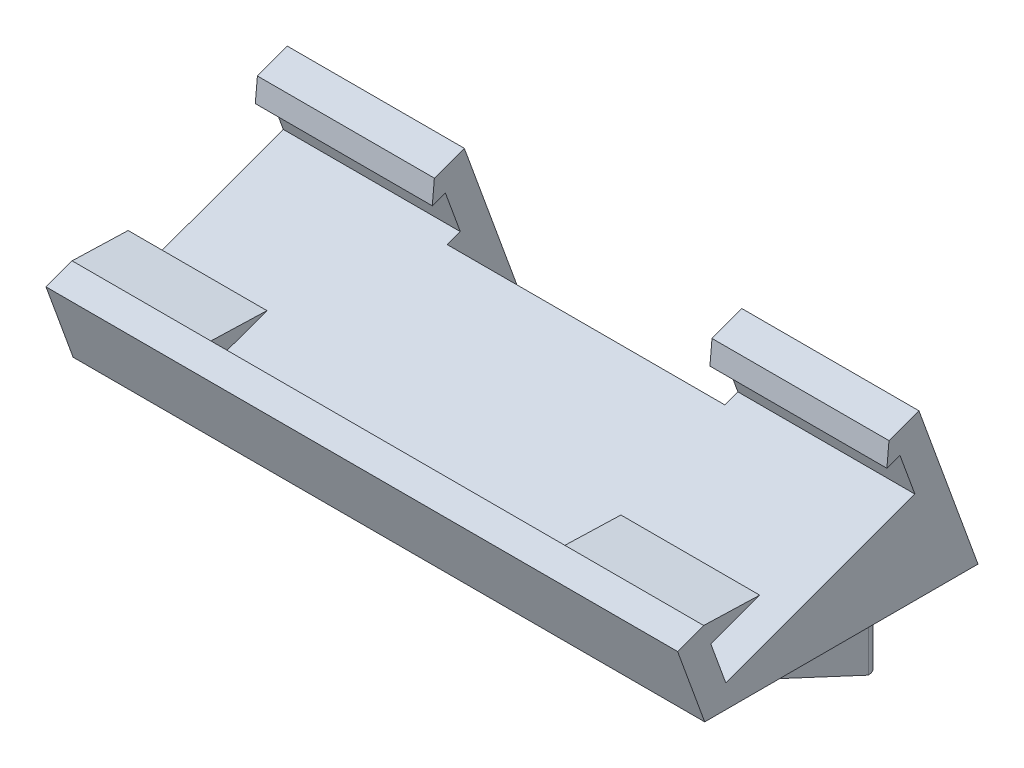
ISO-10303-21;
HEADER;
FILE_DESCRIPTION(('STEP AP214'),'2;1');
FILE_NAME('part.step','',(''),(''),'','','');
FILE_SCHEMA(('AUTOMOTIVE_DESIGN { 1 0 10303 214 1 1 1 1 }'));
ENDSEC;
DATA;
#1=APPLICATION_CONTEXT('core data for automotive mechanical design processes');
#2=APPLICATION_PROTOCOL_DEFINITION('international standard','automotive_design',2000,#1);
#3=PRODUCT_CONTEXT('',#1,'mechanical');
#4=PRODUCT('Part','Part','',(#3));
#5=PRODUCT_RELATED_PRODUCT_CATEGORY('part','',(#4));
#6=PRODUCT_DEFINITION_FORMATION('','',#4);
#7=PRODUCT_DEFINITION_CONTEXT('part definition',#1,'design');
#8=PRODUCT_DEFINITION('design','',#6,#7);
#9=PRODUCT_DEFINITION_SHAPE('','',#8);
#10=(LENGTH_UNIT() NAMED_UNIT(*) SI_UNIT(.MILLI.,.METRE.));
#11=(NAMED_UNIT(*) PLANE_ANGLE_UNIT() SI_UNIT($,.RADIAN.));
#12=(NAMED_UNIT(*) SI_UNIT($,.STERADIAN.) SOLID_ANGLE_UNIT());
#13=UNCERTAINTY_MEASURE_WITH_UNIT(LENGTH_MEASURE(1.E-05),#10,'distance_accuracy_value','');
#14=(GEOMETRIC_REPRESENTATION_CONTEXT(3) GLOBAL_UNCERTAINTY_ASSIGNED_CONTEXT((#13)) GLOBAL_UNIT_ASSIGNED_CONTEXT((#10,
#11,#12)) REPRESENTATION_CONTEXT('',''));
#15=CARTESIAN_POINT('',(0.,0.,0.));
#16=DIRECTION('',(0.,0.,1.));
#17=DIRECTION('',(1.,0.,0.));
#18=AXIS2_PLACEMENT_3D('',#15,#16,#17);
#19=CARTESIAN_POINT('',(45.5,0.,16.656373016007));
#20=DIRECTION('',(0.,1.,0.));
#21=DIRECTION('',(0.,0.,1.));
#22=AXIS2_PLACEMENT_3D('',#19,#20,#21);
#23=PLANE('',#22);
#24=CARTESIAN_POINT('',(-39.775,0.,4.8940842252026));
#25=DIRECTION('',(0.,-1.,0.));
#26=DIRECTION('',(0.,0.,1.));
#27=AXIS2_PLACEMENT_3D('',#24,#25,#26);
#28=CIRCLE('',#27,1.675);
#29=CARTESIAN_POINT('',(-38.1,0.,4.8940842252026));
#30=VERTEX_POINT('',#29);
#31=CARTESIAN_POINT('',(-41.45,0.,4.8940842252026));
#32=VERTEX_POINT('',#31);
#33=EDGE_CURVE('E317',#30,#32,#28,.T.);
#34=ORIENTED_EDGE('',*,*,#33,.F.);
#35=DIRECTION('',(0.,0.,1.));
#36=VECTOR('',#35,1.);
#37=CARTESIAN_POINT('',(-38.1,0.,4.8940842252026));
#38=LINE('',#37,#36);
#39=CARTESIAN_POINT('',(-38.1,0.,-10.9559157747974));
#40=VERTEX_POINT('',#39);
#41=EDGE_CURVE('E305',#40,#30,#38,.T.);
#42=ORIENTED_EDGE('',*,*,#41,.F.);
#43=CARTESIAN_POINT('',(-39.775,0.,-10.9559157747974));
#44=DIRECTION('',(0.,-1.,0.));
#45=DIRECTION('',(0.,0.,1.));
#46=AXIS2_PLACEMENT_3D('',#43,#44,#45);
#47=CIRCLE('',#46,1.675);
#48=CARTESIAN_POINT('',(-41.45,0.,-10.9559157747974));
#49=VERTEX_POINT('',#48);
#50=EDGE_CURVE('E309',#49,#40,#47,.T.);
#51=ORIENTED_EDGE('',*,*,#50,.F.);
#52=DIRECTION('',(0.,0.,-1.));
#53=VECTOR('',#52,1.);
#54=CARTESIAN_POINT('',(-41.45,0.,4.8940842252026));
#55=LINE('',#54,#53);
#56=EDGE_CURVE('E313',#32,#49,#55,.T.);
#57=ORIENTED_EDGE('',*,*,#56,.F.);
#58=EDGE_LOOP('',(#34,#42,#51,#57));
#59=FACE_BOUND('',#58,.T.);
#60=DIRECTION('',(-1.,0.,0.));
#61=VECTOR('',#60,1.);
#62=CARTESIAN_POINT('',(45.5,0.,-22.7182045656017));
#63=LINE('',#62,#61);
#64=CARTESIAN_POINT('',(-20.,0.,-22.7182045656017));
#65=VERTEX_POINT('',#64);
#66=CARTESIAN_POINT('',(-45.5,0.,-22.7182045656017));
#67=VERTEX_POINT('',#66);
#68=EDGE_CURVE('E444',#65,#67,#63,.T.);
#69=ORIENTED_EDGE('',*,*,#68,.F.);
#70=DIRECTION('',(0.,0.,-1.));
#71=VECTOR('',#70,1.);
#72=CARTESIAN_POINT('',(-20.,0.,-22.718642937185));
#73=LINE('',#72,#71);
#74=CARTESIAN_POINT('',(-20.,0.,-16.3331379307463));
#75=VERTEX_POINT('',#74);
#76=EDGE_CURVE('E396',#75,#65,#73,.T.);
#77=ORIENTED_EDGE('',*,*,#76,.F.);
#78=DIRECTION('',(-1.,0.,0.));
#79=VECTOR('',#78,1.);
#80=CARTESIAN_POINT('',(-20.,0.,-16.3331379307463));
#81=LINE('',#80,#79);
#82=CARTESIAN_POINT('',(20.,0.,-16.3331379307463));
#83=VERTEX_POINT('',#82);
#84=EDGE_CURVE('E357',#83,#75,#81,.T.);
#85=ORIENTED_EDGE('',*,*,#84,.F.);
#86=DIRECTION('',(0.,0.,1.));
#87=VECTOR('',#86,1.);
#88=CARTESIAN_POINT('',(20.,0.,-22.718642937185));
#89=LINE('',#88,#87);
#90=CARTESIAN_POINT('',(20.,0.,-22.7182045656017));
#91=VERTEX_POINT('',#90);
#92=EDGE_CURVE('E399',#91,#83,#89,.T.);
#93=ORIENTED_EDGE('',*,*,#92,.F.);
#94=CARTESIAN_POINT('',(45.5,0.,-22.7182045656017));
#95=VERTEX_POINT('',#94);
#96=EDGE_CURVE('E489',#95,#91,#63,.T.);
#97=ORIENTED_EDGE('',*,*,#96,.F.);
#98=DIRECTION('',(0.,0.,-1.));
#99=VECTOR('',#98,1.);
#100=CARTESIAN_POINT('',(45.5,0.,16.656373016007));
#101=LINE('',#100,#99);
#102=CARTESIAN_POINT('',(45.5,0.,16.656373016007));
#103=VERTEX_POINT('',#102);
#104=EDGE_CURVE('E441',#103,#95,#101,.T.);
#105=ORIENTED_EDGE('',*,*,#104,.F.);
#106=DIRECTION('',(-1.,0.,0.));
#107=VECTOR('',#106,1.);
#108=CARTESIAN_POINT('',(45.5,0.,16.656373016007));
#109=LINE('',#108,#107);
#110=CARTESIAN_POINT('',(-45.5,0.,16.656373016007));
#111=VERTEX_POINT('',#110);
#112=EDGE_CURVE('E493',#103,#111,#109,.T.);
#113=ORIENTED_EDGE('',*,*,#112,.T.);
#114=DIRECTION('',(0.,0.,-1.));
#115=VECTOR('',#114,1.);
#116=CARTESIAN_POINT('',(-45.5,0.,16.656373016007));
#117=LINE('',#116,#115);
#118=EDGE_CURVE('E411',#111,#67,#117,.T.);
#119=ORIENTED_EDGE('',*,*,#118,.T.);
#120=EDGE_LOOP('',(#69,#77,#85,#93,#97,#105,#113,#119));
#121=FACE_BOUND('',#120,.T.);
#122=CARTESIAN_POINT('',(39.775,0.,4.89408422520261));
#123=DIRECTION('',(0.,-1.,0.));
#124=DIRECTION('',(0.,0.,-1.));
#125=AXIS2_PLACEMENT_3D('',#122,#123,#124);
#126=CIRCLE('',#125,1.675);
#127=CARTESIAN_POINT('',(41.45,0.,4.89408422520261));
#128=VERTEX_POINT('',#127);
#129=CARTESIAN_POINT('',(38.1,0.,4.89408422520261));
#130=VERTEX_POINT('',#129);
#131=EDGE_CURVE('E321',#128,#130,#126,.T.);
#132=ORIENTED_EDGE('',*,*,#131,.F.);
#133=DIRECTION('',(0.,0.,1.));
#134=VECTOR('',#133,1.);
#135=CARTESIAN_POINT('',(41.45,0.,4.89408422520261));
#136=LINE('',#135,#134);
#137=CARTESIAN_POINT('',(41.45,0.,-10.9559157747974));
#138=VERTEX_POINT('',#137);
#139=EDGE_CURVE('E274',#138,#128,#136,.T.);
#140=ORIENTED_EDGE('',*,*,#139,.F.);
#141=CARTESIAN_POINT('',(39.775,0.,-10.9559157747974));
#142=DIRECTION('',(0.,-1.,0.));
#143=DIRECTION('',(0.,0.,-1.));
#144=AXIS2_PLACEMENT_3D('',#141,#142,#143);
#145=CIRCLE('',#144,1.675);
#146=CARTESIAN_POINT('',(38.1,0.,-10.9559157747974));
#147=VERTEX_POINT('',#146);
#148=EDGE_CURVE('E69',#147,#138,#145,.T.);
#149=ORIENTED_EDGE('',*,*,#148,.F.);
#150=DIRECTION('',(0.,0.,-1.));
#151=VECTOR('',#150,1.);
#152=CARTESIAN_POINT('',(38.1,0.,4.89408422520261));
#153=LINE('',#152,#151);
#154=EDGE_CURVE('E1015',#130,#147,#153,.T.);
#155=ORIENTED_EDGE('',*,*,#154,.F.);
#156=EDGE_LOOP('',(#132,#140,#149,#155));
#157=FACE_BOUND('',#156,.T.);
#158=ADVANCED_FACE('F46',(#59,#121,#157),#23,.F.);
#159=CARTESIAN_POINT('',(45.5,23.3938866763585,-14.2035261516107));
#160=DIRECTION('',(0.,-0.342020143325663,0.93969262078591));
#161=DIRECTION('',(0.,-0.93969262078591,-0.342020143325663));
#162=AXIS2_PLACEMENT_3D('',#159,#160,#161);
#163=PLANE('',#162);
#164=DIRECTION('',(-1.,0.,0.));
#165=VECTOR('',#164,1.);
#166=CARTESIAN_POINT('',(45.5,23.3938866763585,-14.2035261516107));
#167=LINE('',#166,#165);
#168=CARTESIAN_POINT('',(-20.,23.3938866763585,-14.2035261516107));
#169=VERTEX_POINT('',#168);
#170=CARTESIAN_POINT('',(-45.5,23.3938866763585,-14.2035261516107));
#171=VERTEX_POINT('',#170);
#172=EDGE_CURVE('E539',#169,#171,#167,.T.);
#173=ORIENTED_EDGE('',*,*,#172,.F.);
#174=DIRECTION('',(0.,0.93969262078591,0.342020143325664));
#175=VECTOR('',#174,1.);
#176=CARTESIAN_POINT('',(-20.,-0.00120441602640201,-22.718642937185));
#177=LINE('',#176,#175);
#178=EDGE_CURVE('E361',#65,#169,#177,.T.);
#179=ORIENTED_EDGE('',*,*,#178,.F.);
#180=ORIENTED_EDGE('',*,*,#68,.T.);
#181=DIRECTION('',(0.,0.93969262078591,0.342020143325663));
#182=VECTOR('',#181,1.);
#183=CARTESIAN_POINT('',(-45.5,23.3938866763585,-14.2035261516107));
#184=LINE('',#183,#182);
#185=EDGE_CURVE('E350',#67,#171,#184,.T.);
#186=ORIENTED_EDGE('',*,*,#185,.T.);
#187=EDGE_LOOP('',(#173,#179,#180,#186));
#188=FACE_BOUND('',#187,.T.);
#189=ADVANCED_FACE('F557',(#188),#163,.F.);
#190=CARTESIAN_POINT('',(45.5,21.8244123417544,-9.89143085687219));
#191=DIRECTION('',(0.,-0.93969262078591,-0.342020143325663));
#192=DIRECTION('',(0.,0.342020143325663,-0.93969262078591));
#193=AXIS2_PLACEMENT_3D('',#190,#191,#192);
#194=PLANE('',#193);
#195=DIRECTION('',(-1.,0.,0.));
#196=VECTOR('',#195,1.);
#197=CARTESIAN_POINT('',(45.5,21.8244123417544,-9.89143085687219));
#198=LINE('',#197,#196);
#199=CARTESIAN_POINT('',(-20.,21.8244123417544,-9.89143085687219));
#200=VERTEX_POINT('',#199);
#201=CARTESIAN_POINT('',(-45.5,21.8244123417544,-9.89143085687219));
#202=VERTEX_POINT('',#201);
#203=EDGE_CURVE('E535',#200,#202,#198,.T.);
#204=ORIENTED_EDGE('',*,*,#203,.F.);
#205=DIRECTION('',(0.,-0.342020143325664,0.93969262078591));
#206=VECTOR('',#205,1.);
#207=CARTESIAN_POINT('',(-20.,23.3938866763585,-14.2035261516107));
#208=LINE('',#207,#206);
#209=EDGE_CURVE('E377',#169,#200,#208,.T.);
#210=ORIENTED_EDGE('',*,*,#209,.F.);
#211=ORIENTED_EDGE('',*,*,#172,.T.);
#212=DIRECTION('',(0.,-0.342020143325663,0.93969262078591));
#213=VECTOR('',#212,1.);
#214=CARTESIAN_POINT('',(-45.5,21.8244123417544,-9.89143085687219));
#215=LINE('',#214,#213);
#216=EDGE_CURVE('E448',#171,#202,#215,.T.);
#217=ORIENTED_EDGE('',*,*,#216,.T.);
#218=EDGE_LOOP('',(#204,#210,#211,#217));
#219=FACE_BOUND('',#218,.T.);
#220=ADVANCED_FACE('F551',(#219),#194,.F.);
#221=CARTESIAN_POINT('',(45.5,21.8244123417544,-9.89143085687219));
#222=DIRECTION('',(0.,-0.0904888493177173,-0.995897468693015));
#223=DIRECTION('',(0.,0.995897468693016,-0.0904888493177173));
#224=AXIS2_PLACEMENT_3D('',#221,#222,#223);
#225=PLANE('',#224);
#226=DIRECTION('',(-1.,0.,0.));
#227=VECTOR('',#226,1.);
#228=CARTESIAN_POINT('',(45.5,18.5226879540468,-9.5914308568722));
#229=LINE('',#228,#227);
#230=CARTESIAN_POINT('',(-20.,18.5226879540468,-9.5914308568722));
#231=VERTEX_POINT('',#230);
#232=CARTESIAN_POINT('',(-45.5,18.5226879540468,-9.5914308568722));
#233=VERTEX_POINT('',#232);
#234=EDGE_CURVE('E530',#231,#233,#229,.T.);
#235=ORIENTED_EDGE('',*,*,#234,.F.);
#236=DIRECTION('',(0.,-0.995897468693016,0.0904888493177173));
#237=VECTOR('',#236,1.);
#238=CARTESIAN_POINT('',(-20.,1.33346656662751,-8.0295904938714));
#239=LINE('',#238,#237);
#240=EDGE_CURVE('E402',#200,#231,#239,.T.);
#241=ORIENTED_EDGE('',*,*,#240,.F.);
#242=ORIENTED_EDGE('',*,*,#203,.T.);
#243=DIRECTION('',(0.,-0.995897468693015,0.0904888493177173));
#244=VECTOR('',#243,1.);
#245=CARTESIAN_POINT('',(-45.5,21.8244123417544,-9.89143085687219));
#246=LINE('',#245,#244);
#247=EDGE_CURVE('E452',#202,#233,#246,.T.);
#248=ORIENTED_EDGE('',*,*,#247,.T.);
#249=EDGE_LOOP('',(#235,#241,#242,#248));
#250=FACE_BOUND('',#249,.T.);
#251=ADVANCED_FACE('F566',(#250),#225,.F.);
#252=CARTESIAN_POINT('',(45.5,19.2067282406981,-11.470816098444));
#253=DIRECTION('',(0.,0.93969262078591,0.342020143325664));
#254=DIRECTION('',(0.,-0.342020143325664,0.93969262078591));
#255=AXIS2_PLACEMENT_3D('',#252,#253,#254);
#256=PLANE('',#255);
#257=DIRECTION('',(-1.,0.,0.));
#258=VECTOR('',#257,1.);
#259=CARTESIAN_POINT('',(45.5,19.2067282406981,-11.470816098444));
#260=LINE('',#259,#258);
#261=CARTESIAN_POINT('',(-20.,19.2067282406981,-11.470816098444));
#262=VERTEX_POINT('',#261);
#263=CARTESIAN_POINT('',(-45.5,19.2067282406981,-11.470816098444));
#264=VERTEX_POINT('',#263);
#265=EDGE_CURVE('E525',#262,#264,#260,.T.);
#266=ORIENTED_EDGE('',*,*,#265,.F.);
#267=DIRECTION('',(0.,0.342020143325664,-0.93969262078591));
#268=VECTOR('',#267,1.);
#269=CARTESIAN_POINT('',(-20.,20.5748088140008,-15.2295865815877));
#270=LINE('',#269,#268);
#271=EDGE_CURVE('E383',#231,#262,#270,.T.);
#272=ORIENTED_EDGE('',*,*,#271,.F.);
#273=ORIENTED_EDGE('',*,*,#234,.T.);
#274=DIRECTION('',(0.,0.342020143325664,-0.93969262078591));
#275=VECTOR('',#274,1.);
#276=CARTESIAN_POINT('',(-45.5,19.2067282406981,-11.470816098444));
#277=LINE('',#276,#275);
#278=EDGE_CURVE('E456',#233,#264,#277,.T.);
#279=ORIENTED_EDGE('',*,*,#278,.T.);
#280=EDGE_LOOP('',(#266,#272,#273,#279));
#281=FACE_BOUND('',#280,.T.);
#282=ADVANCED_FACE('F637',(#281),#256,.F.);
#283=CARTESIAN_POINT('',(45.5,13.2866647297469,-13.6255430013957));
#284=DIRECTION('',(0.,0.342020143325664,-0.93969262078591));
#285=DIRECTION('',(0.,0.93969262078591,0.342020143325664));
#286=AXIS2_PLACEMENT_3D('',#283,#284,#285);
#287=PLANE('',#286);
#288=DIRECTION('',(-1.,0.,0.));
#289=VECTOR('',#288,1.);
#290=CARTESIAN_POINT('',(45.5,13.2866647297469,-13.6255430013957));
#291=LINE('',#290,#289);
#292=CARTESIAN_POINT('',(-20.,13.2866647297469,-13.6255430013957));
#293=VERTEX_POINT('',#292);
#294=CARTESIAN_POINT('',(-45.5,13.2866647297469,-13.6255430013957));
#295=VERTEX_POINT('',#294);
#296=EDGE_CURVE('E520',#293,#295,#291,.T.);
#297=ORIENTED_EDGE('',*,*,#296,.F.);
#298=DIRECTION('',(0.,-0.93969262078591,-0.342020143325664));
#299=VECTOR('',#298,1.);
#300=CARTESIAN_POINT('',(-20.,-1.36928498932906,-18.9598724540414));
#301=LINE('',#300,#299);
#302=EDGE_CURVE('E380',#262,#293,#301,.T.);
#303=ORIENTED_EDGE('',*,*,#302,.F.);
#304=ORIENTED_EDGE('',*,*,#265,.T.);
#305=DIRECTION('',(0.,-0.93969262078591,-0.342020143325664));
#306=VECTOR('',#305,1.);
#307=CARTESIAN_POINT('',(-45.5,13.2866647297469,-13.6255430013957));
#308=LINE('',#307,#306);
#309=EDGE_CURVE('E460',#264,#295,#308,.T.);
#310=ORIENTED_EDGE('',*,*,#309,.T.);
#311=EDGE_LOOP('',(#297,#303,#304,#310));
#312=FACE_BOUND('',#311,.T.);
#313=ADVANCED_FACE('F633',(#312),#287,.F.);
#314=CARTESIAN_POINT('',(45.5,9.28814408425389,15.7802699043474));
#315=DIRECTION('',(0.,0.93969262078591,0.342020143325663));
#316=DIRECTION('',(0.,-0.342020143325663,0.93969262078591));
#317=AXIS2_PLACEMENT_3D('',#314,#315,#316);
#318=PLANE('',#317);
#319=DIRECTION('',(-1.,0.,0.));
#320=VECTOR('',#319,1.);
#321=CARTESIAN_POINT('',(45.5,9.28814408425389,15.7802699043474));
#322=LINE('',#321,#320);
#323=CARTESIAN_POINT('',(45.5,9.28814408425389,15.7802699043474));
#324=VERTEX_POINT('',#323);
#325=CARTESIAN_POINT('',(25.5,9.28814408425389,15.7802699043474));
#326=VERTEX_POINT('',#325);
#327=EDGE_CURVE('E512',#324,#326,#322,.T.);
#328=ORIENTED_EDGE('',*,*,#327,.T.);
#329=DIRECTION('',(0.,-0.342020143325663,0.93969262078591));
#330=VECTOR('',#329,1.);
#331=CARTESIAN_POINT('',(25.5,11.8532951591964,8.73257524845306));
#332=LINE('',#331,#330);
#333=CARTESIAN_POINT('',(25.5,11.8532951591964,8.73257524845308));
#334=VERTEX_POINT('',#333);
#335=EDGE_CURVE('E334',#334,#326,#332,.T.);
#336=ORIENTED_EDGE('',*,*,#335,.F.);
#337=DIRECTION('',(-1.,0.,0.));
#338=VECTOR('',#337,1.);
#339=CARTESIAN_POINT('',(45.5,11.8532951591964,8.73257524845305));
#340=LINE('',#339,#338);
#341=CARTESIAN_POINT('',(45.5,11.8532951591964,8.73257524845305));
#342=VERTEX_POINT('',#341);
#343=EDGE_CURVE('E507',#342,#334,#340,.T.);
#344=ORIENTED_EDGE('',*,*,#343,.F.);
#345=DIRECTION('',(0.,0.342020143325663,-0.93969262078591));
#346=VECTOR('',#345,1.);
#347=CARTESIAN_POINT('',(45.5,9.28814408425389,15.7802699043474));
#348=LINE('',#347,#346);
#349=EDGE_CURVE('E429',#324,#342,#348,.T.);
#350=ORIENTED_EDGE('',*,*,#349,.F.);
#351=EDGE_LOOP('',(#328,#336,#344,#350));
#352=FACE_BOUND('',#351,.T.);
#353=ADVANCED_FACE('F610',(#352),#318,.F.);
#354=CARTESIAN_POINT('',(45.5,12.1072219466116,16.8063303343244));
#355=DIRECTION('',(0.,-0.999505787353044,0.0314353471075262));
#356=DIRECTION('',(0.,-0.0314353471075262,-0.999505787353045));
#357=AXIS2_PLACEMENT_3D('',#354,#355,#356);
#358=PLANE('',#357);
#359=ORIENTED_EDGE('',*,*,#343,.T.);
#360=DIRECTION('',(0.,-0.0314353471075262,-0.999505787353045));
#361=VECTOR('',#360,1.);
#362=CARTESIAN_POINT('',(25.5,11.5976575949158,0.604424982154378));
#363=LINE('',#362,#361);
#364=CARTESIAN_POINT('',(25.5,12.1072219466116,16.8063303343244));
#365=VERTEX_POINT('',#364);
#366=EDGE_CURVE('E329',#365,#334,#363,.T.);
#367=ORIENTED_EDGE('',*,*,#366,.F.);
#368=DIRECTION('',(-1.,0.,0.));
#369=VECTOR('',#368,1.);
#370=CARTESIAN_POINT('',(45.5,12.1072219466116,16.8063303343244));
#371=LINE('',#370,#369);
#372=CARTESIAN_POINT('',(45.5,12.1072219466116,16.8063303343244));
#373=VERTEX_POINT('',#372);
#374=EDGE_CURVE('E502',#373,#365,#371,.T.);
#375=ORIENTED_EDGE('',*,*,#374,.F.);
#376=DIRECTION('',(0.,0.0314353471075262,0.999505787353044));
#377=VECTOR('',#376,1.);
#378=CARTESIAN_POINT('',(45.5,12.1072219466116,16.8063303343244));
#379=LINE('',#378,#377);
#380=EDGE_CURVE('E432',#342,#373,#379,.T.);
#381=ORIENTED_EDGE('',*,*,#380,.F.);
#382=EDGE_LOOP('',(#359,#367,#375,#381));
#383=FACE_BOUND('',#382,.T.);
#384=ADVANCED_FACE('F604',(#383),#358,.F.);
#385=ORIENTED_EDGE('',*,*,#96,.T.);
#386=DIRECTION('',(0.,0.93969262078591,0.342020143325664));
#387=VECTOR('',#386,1.);
#388=CARTESIAN_POINT('',(20.,-0.00120441602639854,-22.718642937185));
#389=LINE('',#388,#387);
#390=CARTESIAN_POINT('',(20.,23.3938866763585,-14.2035261516107));
#391=VERTEX_POINT('',#390);
#392=EDGE_CURVE('E369',#91,#391,#389,.T.);
#393=ORIENTED_EDGE('',*,*,#392,.T.);
#394=CARTESIAN_POINT('',(45.5,23.3938866763585,-14.2035261516107));
#395=VERTEX_POINT('',#394);
#396=EDGE_CURVE('E55',#395,#391,#167,.T.);
#397=ORIENTED_EDGE('',*,*,#396,.F.);
#398=DIRECTION('',(0.,0.93969262078591,0.342020143325664));
#399=VECTOR('',#398,1.);
#400=CARTESIAN_POINT('',(45.5,14.6547453030495,-17.3843134845393));
#401=LINE('',#400,#399);
#402=EDGE_CURVE('E407',#95,#395,#401,.T.);
#403=ORIENTED_EDGE('',*,*,#402,.F.);
#404=EDGE_LOOP('',(#385,#393,#397,#403));
#405=FACE_BOUND('',#404,.T.);
#406=ADVANCED_FACE('F48',(#405),#163,.F.);
#407=ORIENTED_EDGE('',*,*,#396,.T.);
#408=DIRECTION('',(0.,0.342020143325664,-0.93969262078591));
#409=VECTOR('',#408,1.);
#410=CARTESIAN_POINT('',(20.,23.3938866763585,-14.2035261516107));
#411=LINE('',#410,#409);
#412=CARTESIAN_POINT('',(20.,21.8244123417544,-9.8914308568722));
#413=VERTEX_POINT('',#412);
#414=EDGE_CURVE('E365',#413,#391,#411,.T.);
#415=ORIENTED_EDGE('',*,*,#414,.F.);
#416=CARTESIAN_POINT('',(45.5,21.8244123417544,-9.89143085687219));
#417=VERTEX_POINT('',#416);
#418=EDGE_CURVE('E536',#417,#413,#198,.T.);
#419=ORIENTED_EDGE('',*,*,#418,.F.);
#420=DIRECTION('',(0.,-0.342020143325663,0.93969262078591));
#421=VECTOR('',#420,1.);
#422=CARTESIAN_POINT('',(45.5,21.8244123417544,-9.89143085687219));
#423=LINE('',#422,#421);
#424=EDGE_CURVE('E410',#395,#417,#423,.T.);
#425=ORIENTED_EDGE('',*,*,#424,.F.);
#426=EDGE_LOOP('',(#407,#415,#419,#425));
#427=FACE_BOUND('',#426,.T.);
#428=ADVANCED_FACE('F651',(#427),#194,.F.);
#429=ORIENTED_EDGE('',*,*,#418,.T.);
#430=DIRECTION('',(0.,0.995897468693016,-0.0904888493177173));
#431=VECTOR('',#430,1.);
#432=CARTESIAN_POINT('',(20.,1.33346656662752,-8.0295904938714));
#433=LINE('',#432,#431);
#434=CARTESIAN_POINT('',(20.,18.5226879540468,-9.5914308568722));
#435=VERTEX_POINT('',#434);
#436=EDGE_CURVE('E341',#435,#413,#433,.T.);
#437=ORIENTED_EDGE('',*,*,#436,.F.);
#438=CARTESIAN_POINT('',(45.5,18.5226879540468,-9.5914308568722));
#439=VERTEX_POINT('',#438);
#440=EDGE_CURVE('E531',#439,#435,#229,.T.);
#441=ORIENTED_EDGE('',*,*,#440,.F.);
#442=DIRECTION('',(0.,-0.995897468693015,0.0904888493177173));
#443=VECTOR('',#442,1.);
#444=CARTESIAN_POINT('',(45.5,21.8244123417544,-9.89143085687219));
#445=LINE('',#444,#443);
#446=EDGE_CURVE('E414',#417,#439,#445,.T.);
#447=ORIENTED_EDGE('',*,*,#446,.F.);
#448=EDGE_LOOP('',(#429,#437,#441,#447));
#449=FACE_BOUND('',#448,.T.);
#450=ADVANCED_FACE('F658',(#449),#225,.F.);
#451=ORIENTED_EDGE('',*,*,#440,.T.);
#452=DIRECTION('',(0.,-0.342020143325664,0.93969262078591));
#453=VECTOR('',#452,1.);
#454=CARTESIAN_POINT('',(20.,20.5748088140008,-15.2295865815877));
#455=LINE('',#454,#453);
#456=CARTESIAN_POINT('',(20.,19.2067282406981,-11.470816098444));
#457=VERTEX_POINT('',#456);
#458=EDGE_CURVE('E386',#457,#435,#455,.T.);
#459=ORIENTED_EDGE('',*,*,#458,.F.);
#460=CARTESIAN_POINT('',(45.5,19.2067282406981,-11.470816098444));
#461=VERTEX_POINT('',#460);
#462=EDGE_CURVE('E526',#461,#457,#260,.T.);
#463=ORIENTED_EDGE('',*,*,#462,.F.);
#464=DIRECTION('',(0.,0.342020143325664,-0.93969262078591));
#465=VECTOR('',#464,1.);
#466=CARTESIAN_POINT('',(45.5,19.2067282406981,-11.470816098444));
#467=LINE('',#466,#465);
#468=EDGE_CURVE('E417',#439,#461,#467,.T.);
#469=ORIENTED_EDGE('',*,*,#468,.F.);
#470=EDGE_LOOP('',(#451,#459,#463,#469));
#471=FACE_BOUND('',#470,.T.);
#472=ADVANCED_FACE('F661',(#471),#256,.F.);
#473=ORIENTED_EDGE('',*,*,#462,.T.);
#474=DIRECTION('',(0.,0.93969262078591,0.342020143325664));
#475=VECTOR('',#474,1.);
#476=CARTESIAN_POINT('',(20.,-1.36928498932906,-18.9598724540414));
#477=LINE('',#476,#475);
#478=CARTESIAN_POINT('',(20.,13.2866647297469,-13.6255430013957));
#479=VERTEX_POINT('',#478);
#480=EDGE_CURVE('E288',#479,#457,#477,.T.);
#481=ORIENTED_EDGE('',*,*,#480,.F.);
#482=CARTESIAN_POINT('',(45.5,13.2866647297469,-13.6255430013957));
#483=VERTEX_POINT('',#482);
#484=EDGE_CURVE('E521',#483,#479,#291,.T.);
#485=ORIENTED_EDGE('',*,*,#484,.F.);
#486=DIRECTION('',(0.,-0.93969262078591,-0.342020143325664));
#487=VECTOR('',#486,1.);
#488=CARTESIAN_POINT('',(45.5,13.2866647297469,-13.6255430013957));
#489=LINE('',#488,#487);
#490=EDGE_CURVE('E420',#461,#483,#489,.T.);
#491=ORIENTED_EDGE('',*,*,#490,.F.);
#492=EDGE_LOOP('',(#473,#481,#485,#491));
#493=FACE_BOUND('',#492,.T.);
#494=ADVANCED_FACE('F665',(#493),#287,.F.);
#495=CARTESIAN_POINT('',(45.5,3.36808057330265,13.6255430013957));
#496=DIRECTION('',(0.,-0.93969262078591,-0.342020143325663));
#497=DIRECTION('',(0.,0.342020143325663,-0.93969262078591));
#498=AXIS2_PLACEMENT_3D('',#495,#496,#497);
#499=PLANE('',#498);
#500=DIRECTION('',(1.,0.,0.));
#501=VECTOR('',#500,1.);
#502=CARTESIAN_POINT('',(-20.,12.6026244430956,-11.7461577598239));
#503=LINE('',#502,#501);
#504=CARTESIAN_POINT('',(-20.,12.6026244430956,-11.7461577598239));
#505=VERTEX_POINT('',#504);
#506=CARTESIAN_POINT('',(20.,12.6026244430956,-11.7461577598239));
#507=VERTEX_POINT('',#506);
#508=EDGE_CURVE('E353',#505,#507,#503,.T.);
#509=ORIENTED_EDGE('',*,*,#508,.F.);
#510=DIRECTION('',(0.,-0.342020143325663,0.93969262078591));
#511=VECTOR('',#510,1.);
#512=CARTESIAN_POINT('',(-20.,14.6547453030496,-17.3843134845394));
#513=LINE('',#512,#511);
#514=EDGE_CURVE('E389',#293,#505,#513,.T.);
#515=ORIENTED_EDGE('',*,*,#514,.F.);
#516=ORIENTED_EDGE('',*,*,#296,.T.);
#517=DIRECTION('',(0.,-0.342020143325663,0.93969262078591));
#518=VECTOR('',#517,1.);
#519=CARTESIAN_POINT('',(-45.5,3.36808057330265,13.6255430013957));
#520=LINE('',#519,#518);
#521=CARTESIAN_POINT('',(-45.5,3.36808057330265,13.6255430013957));
#522=VERTEX_POINT('',#521);
#523=EDGE_CURVE('E464',#295,#522,#520,.T.);
#524=ORIENTED_EDGE('',*,*,#523,.T.);
#525=DIRECTION('',(-1.,0.,0.));
#526=VECTOR('',#525,1.);
#527=CARTESIAN_POINT('',(45.5,3.36808057330265,13.6255430013957));
#528=LINE('',#527,#526);
#529=CARTESIAN_POINT('',(45.5,3.36808057330265,13.6255430013957));
#530=VERTEX_POINT('',#529);
#531=EDGE_CURVE('E516',#530,#522,#528,.T.);
#532=ORIENTED_EDGE('',*,*,#531,.F.);
#533=DIRECTION('',(0.,-0.342020143325663,0.93969262078591));
#534=VECTOR('',#533,1.);
#535=CARTESIAN_POINT('',(45.5,3.36808057330265,13.6255430013957));
#536=LINE('',#535,#534);
#537=EDGE_CURVE('E423',#483,#530,#536,.T.);
#538=ORIENTED_EDGE('',*,*,#537,.F.);
#539=ORIENTED_EDGE('',*,*,#484,.T.);
#540=DIRECTION('',(0.,0.342020143325663,-0.93969262078591));
#541=VECTOR('',#540,1.);
#542=CARTESIAN_POINT('',(20.,14.6547453030496,-17.3843134845394));
#543=LINE('',#542,#541);
#544=EDGE_CURVE('E393',#507,#479,#543,.T.);
#545=ORIENTED_EDGE('',*,*,#544,.F.);
#546=EDGE_LOOP('',(#509,#515,#516,#524,#532,#538,#539,#545));
#547=FACE_BOUND('',#546,.T.);
#548=ADVANCED_FACE('F628',(#547),#499,.F.);
#549=CARTESIAN_POINT('',(45.5,3.36808057330265,13.6255430013957));
#550=DIRECTION('',(0.,-0.342020143325663,0.939692620785911));
#551=DIRECTION('',(0.,-0.939692620785911,-0.342020143325663));
#552=AXIS2_PLACEMENT_3D('',#549,#550,#551);
#553=PLANE('',#552);
#554=DIRECTION('',(0.,0.939692620785911,0.342020143325663));
#555=VECTOR('',#554,1.);
#556=CARTESIAN_POINT('',(-45.5,3.36808057330265,13.6255430013957));
#557=LINE('',#556,#555);
#558=CARTESIAN_POINT('',(-45.5,9.28814408425389,15.7802699043474));
#559=VERTEX_POINT('',#558);
#560=EDGE_CURVE('E467',#522,#559,#557,.T.);
#561=ORIENTED_EDGE('',*,*,#560,.T.);
#562=CARTESIAN_POINT('',(-25.5,9.28814408425389,15.7802699043474));
#563=VERTEX_POINT('',#562);
#564=EDGE_CURVE('E511',#563,#559,#322,.T.);
#565=ORIENTED_EDGE('',*,*,#564,.F.);
#566=DIRECTION('',(0.,0.93969262078591,0.342020143325664));
#567=VECTOR('',#566,1.);
#568=CARTESIAN_POINT('',(-25.5,-11.2878691457733,8.29121354875003));
#569=LINE('',#568,#567);
#570=CARTESIAN_POINT('',(-25.5,12.1072219466116,16.8063303343244));
#571=VERTEX_POINT('',#570);
#572=EDGE_CURVE('E346',#563,#571,#569,.T.);
#573=ORIENTED_EDGE('',*,*,#572,.T.);
#574=DIRECTION('',(1.,0.,0.));
#575=VECTOR('',#574,1.);
#576=CARTESIAN_POINT('',(-25.5,12.1072219466116,16.8063303343244));
#577=LINE('',#576,#575);
#578=EDGE_CURVE('E325',#571,#365,#577,.T.);
#579=ORIENTED_EDGE('',*,*,#578,.T.);
#580=DIRECTION('',(0.,0.93969262078591,0.342020143325664));
#581=VECTOR('',#580,1.);
#582=CARTESIAN_POINT('',(25.5,-11.2878691457733,8.29121354875003));
#583=LINE('',#582,#581);
#584=EDGE_CURVE('E338',#326,#365,#583,.T.);
#585=ORIENTED_EDGE('',*,*,#584,.F.);
#586=ORIENTED_EDGE('',*,*,#327,.F.);
#587=DIRECTION('',(0.,0.939692620785911,0.342020143325663));
#588=VECTOR('',#587,1.);
#589=CARTESIAN_POINT('',(45.5,3.36808057330265,13.6255430013957));
#590=LINE('',#589,#588);
#591=EDGE_CURVE('E426',#530,#324,#590,.T.);
#592=ORIENTED_EDGE('',*,*,#591,.F.);
#593=ORIENTED_EDGE('',*,*,#531,.T.);
#594=EDGE_LOOP('',(#561,#565,#573,#579,#585,#586,#592,#593));
#595=FACE_BOUND('',#594,.T.);
#596=ADVANCED_FACE('F615',(#595),#553,.F.);
#597=CARTESIAN_POINT('',(-25.5,11.8532951591964,8.73257524845308));
#598=VERTEX_POINT('',#597);
#599=CARTESIAN_POINT('',(-45.5,11.8532951591964,8.73257524845305));
#600=VERTEX_POINT('',#599);
#601=EDGE_CURVE('E506',#598,#600,#340,.T.);
#602=ORIENTED_EDGE('',*,*,#601,.F.);
#603=DIRECTION('',(0.,0.342020143325663,-0.93969262078591));
#604=VECTOR('',#603,1.);
#605=CARTESIAN_POINT('',(-25.5,11.8532951591964,8.73257524845306));
#606=LINE('',#605,#604);
#607=EDGE_CURVE('E331',#563,#598,#606,.T.);
#608=ORIENTED_EDGE('',*,*,#607,.F.);
#609=ORIENTED_EDGE('',*,*,#564,.T.);
#610=DIRECTION('',(0.,0.342020143325663,-0.93969262078591));
#611=VECTOR('',#610,1.);
#612=CARTESIAN_POINT('',(-45.5,9.28814408425389,15.7802699043474));
#613=LINE('',#612,#611);
#614=EDGE_CURVE('E471',#559,#600,#613,.T.);
#615=ORIENTED_EDGE('',*,*,#614,.T.);
#616=EDGE_LOOP('',(#602,#608,#609,#615));
#617=FACE_BOUND('',#616,.T.);
#618=ADVANCED_FACE('F621',(#617),#318,.F.);
#619=CARTESIAN_POINT('',(-45.5,12.1072219466116,16.8063303343244));
#620=VERTEX_POINT('',#619);
#621=EDGE_CURVE('E501',#571,#620,#371,.T.);
#622=ORIENTED_EDGE('',*,*,#621,.F.);
#623=DIRECTION('',(0.,0.0314353471075262,0.999505787353045));
#624=VECTOR('',#623,1.);
#625=CARTESIAN_POINT('',(-25.5,11.5976575949158,0.604424982154378));
#626=LINE('',#625,#624);
#627=EDGE_CURVE('E330',#598,#571,#626,.T.);
#628=ORIENTED_EDGE('',*,*,#627,.F.);
#629=ORIENTED_EDGE('',*,*,#601,.T.);
#630=DIRECTION('',(0.,0.0314353471075262,0.999505787353044));
#631=VECTOR('',#630,1.);
#632=CARTESIAN_POINT('',(-45.5,12.1072219466116,16.8063303343244));
#633=LINE('',#632,#631);
#634=EDGE_CURVE('E475',#600,#620,#633,.T.);
#635=ORIENTED_EDGE('',*,*,#634,.T.);
#636=EDGE_LOOP('',(#622,#628,#629,#635));
#637=FACE_BOUND('',#636,.T.);
#638=ADVANCED_FACE('F585',(#637),#358,.F.);
#639=CARTESIAN_POINT('',(45.5,12.1072219466116,16.8063303343244));
#640=DIRECTION('',(0.,-0.93969262078591,-0.342020143325664));
#641=DIRECTION('',(0.,0.342020143325664,-0.93969262078591));
#642=AXIS2_PLACEMENT_3D('',#639,#640,#641);
#643=PLANE('',#642);
#644=DIRECTION('',(0.,-0.342020143325664,0.93969262078591));
#645=VECTOR('',#644,1.);
#646=CARTESIAN_POINT('',(-45.5,12.1072219466116,16.8063303343244));
#647=LINE('',#646,#645);
#648=CARTESIAN_POINT('',(-45.5,10.739141373309,20.565100817468));
#649=VERTEX_POINT('',#648);
#650=EDGE_CURVE('E479',#620,#649,#647,.T.);
#651=ORIENTED_EDGE('',*,*,#650,.T.);
#652=DIRECTION('',(-1.,0.,0.));
#653=VECTOR('',#652,1.);
#654=CARTESIAN_POINT('',(45.5,10.739141373309,20.565100817468));
#655=LINE('',#654,#653);
#656=CARTESIAN_POINT('',(45.5,10.739141373309,20.565100817468));
#657=VERTEX_POINT('',#656);
#658=EDGE_CURVE('E497',#657,#649,#655,.T.);
#659=ORIENTED_EDGE('',*,*,#658,.F.);
#660=DIRECTION('',(0.,-0.342020143325664,0.93969262078591));
#661=VECTOR('',#660,1.);
#662=CARTESIAN_POINT('',(45.5,12.1072219466116,16.8063303343244));
#663=LINE('',#662,#661);
#664=EDGE_CURVE('E435',#373,#657,#663,.T.);
#665=ORIENTED_EDGE('',*,*,#664,.F.);
#666=ORIENTED_EDGE('',*,*,#374,.T.);
#667=ORIENTED_EDGE('',*,*,#578,.F.);
#668=ORIENTED_EDGE('',*,*,#621,.T.);
#669=EDGE_LOOP('',(#651,#659,#665,#666,#667,#668));
#670=FACE_BOUND('',#669,.T.);
#671=ADVANCED_FACE('F579',(#670),#643,.F.);
#672=CARTESIAN_POINT('',(45.5,2.,17.3843134845393));
#673=DIRECTION('',(0.,0.342020143325664,-0.93969262078591));
#674=DIRECTION('',(0.,0.93969262078591,0.342020143325664));
#675=AXIS2_PLACEMENT_3D('',#672,#673,#674);
#676=PLANE('',#675);
#677=DIRECTION('',(0.,-0.93969262078591,-0.342020143325664));
#678=VECTOR('',#677,1.);
#679=CARTESIAN_POINT('',(-45.5,2.,17.3843134845393));
#680=LINE('',#679,#678);
#681=EDGE_CURVE('E483',#649,#111,#680,.T.);
#682=ORIENTED_EDGE('',*,*,#681,.T.);
#683=ORIENTED_EDGE('',*,*,#112,.F.);
#684=DIRECTION('',(0.,-0.93969262078591,-0.342020143325663));
#685=VECTOR('',#684,1.);
#686=CARTESIAN_POINT('',(45.5,10.739141373309,20.565100817468));
#687=LINE('',#686,#685);
#688=EDGE_CURVE('E438',#657,#103,#687,.T.);
#689=ORIENTED_EDGE('',*,*,#688,.F.);
#690=ORIENTED_EDGE('',*,*,#658,.T.);
#691=EDGE_LOOP('',(#682,#683,#689,#690));
#692=FACE_BOUND('',#691,.T.);
#693=ADVANCED_FACE('F590',(#692),#676,.F.);
#694=CARTESIAN_POINT('',(45.5,0.,0.));
#695=DIRECTION('',(-1.,0.,0.));
#696=DIRECTION('',(0.,0.,1.));
#697=AXIS2_PLACEMENT_3D('',#694,#695,#696);
#698=PLANE('',#697);
#699=ORIENTED_EDGE('',*,*,#402,.T.);
#700=ORIENTED_EDGE('',*,*,#424,.T.);
#701=ORIENTED_EDGE('',*,*,#446,.T.);
#702=ORIENTED_EDGE('',*,*,#468,.T.);
#703=ORIENTED_EDGE('',*,*,#490,.T.);
#704=ORIENTED_EDGE('',*,*,#537,.T.);
#705=ORIENTED_EDGE('',*,*,#591,.T.);
#706=ORIENTED_EDGE('',*,*,#349,.T.);
#707=ORIENTED_EDGE('',*,*,#380,.T.);
#708=ORIENTED_EDGE('',*,*,#664,.T.);
#709=ORIENTED_EDGE('',*,*,#688,.T.);
#710=ORIENTED_EDGE('',*,*,#104,.T.);
#711=EDGE_LOOP('',(#699,#700,#701,#702,#703,#704,#705,#706,#707,#708,#709,#710));
#712=FACE_BOUND('',#711,.T.);
#713=ADVANCED_FACE('F598',(#712),#698,.F.);
#714=CARTESIAN_POINT('',(-45.5,0.,0.));
#715=DIRECTION('',(-1.,0.,0.));
#716=DIRECTION('',(0.,0.,1.));
#717=AXIS2_PLACEMENT_3D('',#714,#715,#716);
#718=PLANE('',#717);
#719=ORIENTED_EDGE('',*,*,#185,.F.);
#720=ORIENTED_EDGE('',*,*,#118,.F.);
#721=ORIENTED_EDGE('',*,*,#681,.F.);
#722=ORIENTED_EDGE('',*,*,#650,.F.);
#723=ORIENTED_EDGE('',*,*,#634,.F.);
#724=ORIENTED_EDGE('',*,*,#614,.F.);
#725=ORIENTED_EDGE('',*,*,#560,.F.);
#726=ORIENTED_EDGE('',*,*,#523,.F.);
#727=ORIENTED_EDGE('',*,*,#309,.F.);
#728=ORIENTED_EDGE('',*,*,#278,.F.);
#729=ORIENTED_EDGE('',*,*,#247,.F.);
#730=ORIENTED_EDGE('',*,*,#216,.F.);
#731=EDGE_LOOP('',(#719,#720,#721,#722,#723,#724,#725,#726,#727,#728,#729,#730));
#732=FACE_BOUND('',#731,.T.);
#733=ADVANCED_FACE('F561',(#732),#718,.T.);
#734=CARTESIAN_POINT('',(-20.,-0.00120441602640201,-22.718642937185));
#735=DIRECTION('',(-1.,0.,0.));
#736=DIRECTION('',(0.,0.,1.));
#737=AXIS2_PLACEMENT_3D('',#734,#735,#736);
#738=PLANE('',#737);
#739=ORIENTED_EDGE('',*,*,#240,.T.);
#740=ORIENTED_EDGE('',*,*,#271,.T.);
#741=ORIENTED_EDGE('',*,*,#302,.T.);
#742=ORIENTED_EDGE('',*,*,#514,.T.);
#743=DIRECTION('',(0.,0.93969262078591,0.342020143325664));
#744=VECTOR('',#743,1.);
#745=CARTESIAN_POINT('',(-20.,-2.05332527598039,-17.0804872124696));
#746=LINE('',#745,#744);
#747=EDGE_CURVE('E362',#75,#505,#746,.T.);
#748=ORIENTED_EDGE('',*,*,#747,.F.);
#749=ORIENTED_EDGE('',*,*,#76,.T.);
#750=ORIENTED_EDGE('',*,*,#178,.T.);
#751=ORIENTED_EDGE('',*,*,#209,.T.);
#752=EDGE_LOOP('',(#739,#740,#741,#742,#748,#749,#750,#751));
#753=FACE_BOUND('',#752,.T.);
#754=ADVANCED_FACE('F639',(#753),#738,.F.);
#755=CARTESIAN_POINT('',(20.,-0.00120441602639854,-22.718642937185));
#756=DIRECTION('',(1.,0.,0.));
#757=DIRECTION('',(0.,0.,-1.));
#758=AXIS2_PLACEMENT_3D('',#755,#756,#757);
#759=PLANE('',#758);
#760=ORIENTED_EDGE('',*,*,#436,.T.);
#761=ORIENTED_EDGE('',*,*,#414,.T.);
#762=ORIENTED_EDGE('',*,*,#392,.F.);
#763=ORIENTED_EDGE('',*,*,#92,.T.);
#764=DIRECTION('',(0.,0.93969262078591,0.342020143325664));
#765=VECTOR('',#764,1.);
#766=CARTESIAN_POINT('',(20.,-2.05332527598038,-17.0804872124696));
#767=LINE('',#766,#765);
#768=EDGE_CURVE('E366',#83,#507,#767,.T.);
#769=ORIENTED_EDGE('',*,*,#768,.T.);
#770=ORIENTED_EDGE('',*,*,#544,.T.);
#771=ORIENTED_EDGE('',*,*,#480,.T.);
#772=ORIENTED_EDGE('',*,*,#458,.T.);
#773=EDGE_LOOP('',(#760,#761,#762,#763,#769,#770,#771,#772));
#774=FACE_BOUND('',#773,.T.);
#775=ADVANCED_FACE('F647',(#774),#759,.F.);
#776=CARTESIAN_POINT('',(-20.,-2.05332527598039,-17.0804872124696));
#777=DIRECTION('',(0.,-0.342020143325664,0.93969262078591));
#778=DIRECTION('',(0.,-0.93969262078591,-0.342020143325664));
#779=AXIS2_PLACEMENT_3D('',#776,#777,#778);
#780=PLANE('',#779);
#781=ORIENTED_EDGE('',*,*,#508,.T.);
#782=ORIENTED_EDGE('',*,*,#768,.F.);
#783=ORIENTED_EDGE('',*,*,#84,.T.);
#784=ORIENTED_EDGE('',*,*,#747,.T.);
#785=EDGE_LOOP('',(#781,#782,#783,#784));
#786=FACE_BOUND('',#785,.T.);
#787=ADVANCED_FACE('F644',(#786),#780,.F.);
#788=CARTESIAN_POINT('',(25.5,-8.72271807083084,1.24351889285571));
#789=DIRECTION('',(1.,0.,0.));
#790=DIRECTION('',(0.,0.,-1.));
#791=AXIS2_PLACEMENT_3D('',#788,#789,#790);
#792=PLANE('',#791);
#793=ORIENTED_EDGE('',*,*,#335,.T.);
#794=ORIENTED_EDGE('',*,*,#584,.T.);
#795=ORIENTED_EDGE('',*,*,#366,.T.);
#796=EDGE_LOOP('',(#793,#794,#795));
#797=FACE_BOUND('',#796,.T.);
#798=ADVANCED_FACE('F608',(#797),#792,.F.);
#799=CARTESIAN_POINT('',(-25.5,-8.72271807083084,1.24351889285571));
#800=DIRECTION('',(-1.,0.,0.));
#801=DIRECTION('',(0.,0.,1.));
#802=AXIS2_PLACEMENT_3D('',#799,#800,#801);
#803=PLANE('',#802);
#804=ORIENTED_EDGE('',*,*,#607,.T.);
#805=ORIENTED_EDGE('',*,*,#627,.T.);
#806=ORIENTED_EDGE('',*,*,#572,.F.);
#807=EDGE_LOOP('',(#804,#805,#806));
#808=FACE_BOUND('',#807,.T.);
#809=ADVANCED_FACE('F619',(#808),#803,.F.);
#810=CARTESIAN_POINT('',(-39.775,-10.,4.8940842252026));
#811=DIRECTION('',(0.,1.,0.));
#812=DIRECTION('',(0.,0.,1.));
#813=AXIS2_PLACEMENT_3D('',#810,#811,#812);
#814=CYLINDRICAL_SURFACE('',#813,1.675);
#815=CARTESIAN_POINT('',(-39.775,-2.6090236182434,4.8940842252026));
#816=DIRECTION('',(0.,0.906307787036653,-0.422618261740694));
#817=DIRECTION('',(0.,0.422618261740694,0.906307787036653));
#818=AXIS2_PLACEMENT_3D('',#815,#816,#817);
#819=ELLIPSE('',#818,1.84815801426217,1.675);
#820=CARTESIAN_POINT('',(-41.45,-2.6090236182434,4.8940842252026));
#821=VERTEX_POINT('',#820);
#822=CARTESIAN_POINT('',(-38.1,-2.6090236182434,4.8940842252026));
#823=VERTEX_POINT('',#822);
#824=EDGE_CURVE('E1000',#821,#823,#819,.T.);
#825=ORIENTED_EDGE('',*,*,#824,.T.);
#826=DIRECTION('',(0.,1.,0.));
#827=VECTOR('',#826,1.);
#828=CARTESIAN_POINT('',(-38.1,-10.,4.8940842252026));
#829=LINE('',#828,#827);
#830=EDGE_CURVE('E301',#823,#30,#829,.T.);
#831=ORIENTED_EDGE('',*,*,#830,.T.);
#832=ORIENTED_EDGE('',*,*,#33,.T.);
#833=DIRECTION('',(0.,1.,0.));
#834=VECTOR('',#833,1.);
#835=CARTESIAN_POINT('',(-41.45,-10.,4.8940842252026));
#836=LINE('',#835,#834);
#837=EDGE_CURVE('E289',#821,#32,#836,.T.);
#838=ORIENTED_EDGE('',*,*,#837,.F.);
#839=EDGE_LOOP('',(#825,#831,#832,#838));
#840=FACE_BOUND('',#839,.T.);
#841=ADVANCED_FACE('F750',(#840),#814,.T.);
#842=CARTESIAN_POINT('',(-41.45,-10.,4.8940842252026));
#843=DIRECTION('',(1.,0.,0.));
#844=DIRECTION('',(0.,0.,-1.));
#845=AXIS2_PLACEMENT_3D('',#842,#843,#844);
#846=PLANE('',#845);
#847=DIRECTION('',(0.,1.,0.));
#848=VECTOR('',#847,1.);
#849=CARTESIAN_POINT('',(-41.45,-10.,-10.9559157747974));
#850=LINE('',#849,#848);
#851=CARTESIAN_POINT('',(-41.45,-10.,-10.9559157747974));
#852=VERTEX_POINT('',#851);
#853=EDGE_CURVE('E292',#852,#49,#850,.T.);
#854=ORIENTED_EDGE('',*,*,#853,.F.);
#855=DIRECTION('',(0.,0.422618261740694,0.906307787036653));
#856=VECTOR('',#855,1.);
#857=CARTESIAN_POINT('',(-41.45,-3.92909778828217,2.0631760319685));
#858=LINE('',#857,#856);
#859=EDGE_CURVE('E293',#852,#821,#858,.T.);
#860=ORIENTED_EDGE('',*,*,#859,.T.);
#861=ORIENTED_EDGE('',*,*,#837,.T.);
#862=ORIENTED_EDGE('',*,*,#56,.T.);
#863=EDGE_LOOP('',(#854,#860,#861,#862));
#864=FACE_BOUND('',#863,.T.);
#865=ADVANCED_FACE('F765',(#864),#846,.F.);
#866=CARTESIAN_POINT('',(-39.775,-10.,-10.9559157747974));
#867=DIRECTION('',(0.,1.,0.));
#868=DIRECTION('',(0.,0.,1.));
#869=AXIS2_PLACEMENT_3D('',#866,#867,#868);
#870=CYLINDRICAL_SURFACE('',#869,1.675);
#871=ORIENTED_EDGE('',*,*,#50,.T.);
#872=DIRECTION('',(0.,1.,0.));
#873=VECTOR('',#872,1.);
#874=CARTESIAN_POINT('',(-38.1,-10.,-10.9559157747974));
#875=LINE('',#874,#873);
#876=CARTESIAN_POINT('',(-38.1,-10.,-10.9559157747974));
#877=VERTEX_POINT('',#876);
#878=EDGE_CURVE('E297',#877,#40,#875,.T.);
#879=ORIENTED_EDGE('',*,*,#878,.F.);
#880=CARTESIAN_POINT('',(-39.775,-10.,-10.9559157747974));
#881=DIRECTION('',(0.,-1.,0.));
#882=DIRECTION('',(0.,0.,1.));
#883=AXIS2_PLACEMENT_3D('',#880,#881,#882);
#884=CIRCLE('',#883,1.675);
#885=EDGE_CURVE('E304',#852,#877,#884,.T.);
#886=ORIENTED_EDGE('',*,*,#885,.F.);
#887=ORIENTED_EDGE('',*,*,#853,.T.);
#888=EDGE_LOOP('',(#871,#879,#886,#887));
#889=FACE_BOUND('',#888,.T.);
#890=ADVANCED_FACE('F775',(#889),#870,.T.);
#891=CARTESIAN_POINT('',(-38.1,-10.,4.8940842252026));
#892=DIRECTION('',(-1.,0.,0.));
#893=DIRECTION('',(0.,0.,1.));
#894=AXIS2_PLACEMENT_3D('',#891,#892,#893);
#895=PLANE('',#894);
#896=ORIENTED_EDGE('',*,*,#830,.F.);
#897=DIRECTION('',(0.,-0.422618261740694,-0.906307787036653));
#898=VECTOR('',#897,1.);
#899=CARTESIAN_POINT('',(-38.1,-3.92909778828217,2.0631760319685));
#900=LINE('',#899,#898);
#901=EDGE_CURVE('E992',#823,#877,#900,.T.);
#902=ORIENTED_EDGE('',*,*,#901,.T.);
#903=ORIENTED_EDGE('',*,*,#878,.T.);
#904=ORIENTED_EDGE('',*,*,#41,.T.);
#905=EDGE_LOOP('',(#896,#902,#903,#904));
#906=FACE_BOUND('',#905,.T.);
#907=ADVANCED_FACE('F785',(#906),#895,.F.);
#908=CARTESIAN_POINT('',(-39.775,-10.,4.8940842252026));
#909=DIRECTION('',(0.,1.,0.));
#910=DIRECTION('',(0.,0.,1.));
#911=AXIS2_PLACEMENT_3D('',#908,#909,#910);
#912=PLANE('',#911);
#913=ORIENTED_EDGE('',*,*,#885,.T.);
#914=DIRECTION('',(1.,0.,0.));
#915=VECTOR('',#914,1.);
#916=CARTESIAN_POINT('',(-45.5,-10.,-10.9559157747974));
#917=LINE('',#916,#915);
#918=EDGE_CURVE('E266',#852,#877,#917,.T.);
#919=ORIENTED_EDGE('',*,*,#918,.F.);
#920=EDGE_LOOP('',(#913,#919));
#921=FACE_BOUND('',#920,.T.);
#922=ADVANCED_FACE('F795',(#921),#912,.F.);
#923=CARTESIAN_POINT('',(39.775,-10.,4.89408422520261));
#924=DIRECTION('',(0.,1.,0.));
#925=DIRECTION('',(0.,0.,1.));
#926=AXIS2_PLACEMENT_3D('',#923,#924,#925);
#927=CYLINDRICAL_SURFACE('',#926,1.675);
#928=CARTESIAN_POINT('',(39.775,-2.6090236182434,4.89408422520261));
#929=DIRECTION('',(0.,0.906307787036653,-0.422618261740694));
#930=DIRECTION('',(0.,0.422618261740694,0.906307787036653));
#931=AXIS2_PLACEMENT_3D('',#928,#929,#930);
#932=ELLIPSE('',#931,1.84815801426217,1.675);
#933=CARTESIAN_POINT('',(38.1,-2.6090236182434,4.89408422520261));
#934=VERTEX_POINT('',#933);
#935=CARTESIAN_POINT('',(41.45,-2.6090236182434,4.89408422520261));
#936=VERTEX_POINT('',#935);
#937=EDGE_CURVE('E1001',#934,#936,#932,.T.);
#938=ORIENTED_EDGE('',*,*,#937,.T.);
#939=DIRECTION('',(0.,1.,0.));
#940=VECTOR('',#939,1.);
#941=CARTESIAN_POINT('',(41.45,-10.,4.89408422520261));
#942=LINE('',#941,#940);
#943=EDGE_CURVE('E264',#936,#128,#942,.T.);
#944=ORIENTED_EDGE('',*,*,#943,.T.);
#945=ORIENTED_EDGE('',*,*,#131,.T.);
#946=DIRECTION('',(0.,1.,0.));
#947=VECTOR('',#946,1.);
#948=CARTESIAN_POINT('',(38.1,-10.,4.89408422520261));
#949=LINE('',#948,#947);
#950=EDGE_CURVE('E62',#934,#130,#949,.T.);
#951=ORIENTED_EDGE('',*,*,#950,.F.);
#952=EDGE_LOOP('',(#938,#944,#945,#951));
#953=FACE_BOUND('',#952,.T.);
#954=ADVANCED_FACE('F805',(#953),#927,.T.);
#955=CARTESIAN_POINT('',(38.1,-10.,4.89408422520261));
#956=DIRECTION('',(1.,0.,0.));
#957=DIRECTION('',(0.,0.,-1.));
#958=AXIS2_PLACEMENT_3D('',#955,#956,#957);
#959=PLANE('',#958);
#960=DIRECTION('',(0.,1.,0.));
#961=VECTOR('',#960,1.);
#962=CARTESIAN_POINT('',(38.1,-10.,-10.9559157747974));
#963=LINE('',#962,#961);
#964=CARTESIAN_POINT('',(38.1,-10.,-10.9559157747974));
#965=VERTEX_POINT('',#964);
#966=EDGE_CURVE('E278',#965,#147,#963,.T.);
#967=ORIENTED_EDGE('',*,*,#966,.F.);
#968=DIRECTION('',(0.,0.422618261740694,0.906307787036653));
#969=VECTOR('',#968,1.);
#970=CARTESIAN_POINT('',(38.1,-3.92909778828217,2.06317603196851));
#971=LINE('',#970,#969);
#972=EDGE_CURVE('E254',#965,#934,#971,.T.);
#973=ORIENTED_EDGE('',*,*,#972,.T.);
#974=ORIENTED_EDGE('',*,*,#950,.T.);
#975=ORIENTED_EDGE('',*,*,#154,.T.);
#976=EDGE_LOOP('',(#967,#973,#974,#975));
#977=FACE_BOUND('',#976,.T.);
#978=ADVANCED_FACE('F815',(#977),#959,.F.);
#979=CARTESIAN_POINT('',(39.775,-10.,-10.9559157747974));
#980=DIRECTION('',(0.,1.,0.));
#981=DIRECTION('',(0.,0.,1.));
#982=AXIS2_PLACEMENT_3D('',#979,#980,#981);
#983=CYLINDRICAL_SURFACE('',#982,1.675);
#984=ORIENTED_EDGE('',*,*,#148,.T.);
#985=DIRECTION('',(0.,1.,0.));
#986=VECTOR('',#985,1.);
#987=CARTESIAN_POINT('',(41.45,-10.,-10.9559157747974));
#988=LINE('',#987,#986);
#989=CARTESIAN_POINT('',(41.45,-10.,-10.9559157747974));
#990=VERTEX_POINT('',#989);
#991=EDGE_CURVE('E263',#990,#138,#988,.T.);
#992=ORIENTED_EDGE('',*,*,#991,.F.);
#993=CARTESIAN_POINT('',(39.775,-10.,-10.9559157747974));
#994=DIRECTION('',(0.,-1.,0.));
#995=DIRECTION('',(0.,0.,-1.));
#996=AXIS2_PLACEMENT_3D('',#993,#994,#995);
#997=CIRCLE('',#996,1.675);
#998=EDGE_CURVE('E269',#965,#990,#997,.T.);
#999=ORIENTED_EDGE('',*,*,#998,.F.);
#1000=ORIENTED_EDGE('',*,*,#966,.T.);
#1001=EDGE_LOOP('',(#984,#992,#999,#1000));
#1002=FACE_BOUND('',#1001,.T.);
#1003=ADVANCED_FACE('F276',(#1002),#983,.T.);
#1004=CARTESIAN_POINT('',(41.45,-10.,4.89408422520261));
#1005=DIRECTION('',(-1.,0.,0.));
#1006=DIRECTION('',(0.,0.,1.));
#1007=AXIS2_PLACEMENT_3D('',#1004,#1005,#1006);
#1008=PLANE('',#1007);
#1009=ORIENTED_EDGE('',*,*,#943,.F.);
#1010=DIRECTION('',(0.,0.422618261740694,0.906307787036653));
#1011=VECTOR('',#1010,1.);
#1012=CARTESIAN_POINT('',(41.45,-1.82795829083379,6.56908422520261));
#1013=LINE('',#1012,#1011);
#1014=EDGE_CURVE('E252',#990,#936,#1013,.T.);
#1015=ORIENTED_EDGE('',*,*,#1014,.F.);
#1016=ORIENTED_EDGE('',*,*,#991,.T.);
#1017=ORIENTED_EDGE('',*,*,#139,.T.);
#1018=EDGE_LOOP('',(#1009,#1015,#1016,#1017));
#1019=FACE_BOUND('',#1018,.T.);
#1020=ADVANCED_FACE('F260',(#1019),#1008,.F.);
#1021=CARTESIAN_POINT('',(39.775,-10.,4.89408422520261));
#1022=DIRECTION('',(0.,-1.,0.));
#1023=DIRECTION('',(0.,0.,-1.));
#1024=AXIS2_PLACEMENT_3D('',#1021,#1022,#1023);
#1025=PLANE('',#1024);
#1026=DIRECTION('',(1.,0.,0.));
#1027=VECTOR('',#1026,1.);
#1028=CARTESIAN_POINT('',(39.775,-10.,-10.9559157747974));
#1029=LINE('',#1028,#1027);
#1030=EDGE_CURVE('E12',#965,#990,#1029,.T.);
#1031=ORIENTED_EDGE('',*,*,#1030,.F.);
#1032=ORIENTED_EDGE('',*,*,#998,.T.);
#1033=EDGE_LOOP('',(#1031,#1032));
#1034=FACE_BOUND('',#1033,.T.);
#1035=ADVANCED_FACE('F270',(#1034),#1025,.T.);
#1036=CARTESIAN_POINT('',(-45.5,-1.82795829083379,6.56908422520261));
#1037=DIRECTION('',(0.,0.906307787036653,-0.422618261740694));
#1038=DIRECTION('',(0.,0.422618261740694,0.906307787036653));
#1039=AXIS2_PLACEMENT_3D('',#1036,#1037,#1038);
#1040=PLANE('',#1039);
#1041=ORIENTED_EDGE('',*,*,#937,.F.);
#1042=ORIENTED_EDGE('',*,*,#972,.F.);
#1043=ORIENTED_EDGE('',*,*,#1030,.T.);
#1044=ORIENTED_EDGE('',*,*,#1014,.T.);
#1045=EDGE_LOOP('',(#1041,#1042,#1043,#1044));
#1046=FACE_BOUND('',#1045,.T.);
#1047=ADVANCED_FACE('F251',(#1046),#1040,.F.);
#1048=ORIENTED_EDGE('',*,*,#918,.T.);
#1049=ORIENTED_EDGE('',*,*,#901,.F.);
#1050=ORIENTED_EDGE('',*,*,#824,.F.);
#1051=ORIENTED_EDGE('',*,*,#859,.F.);
#1052=EDGE_LOOP('',(#1048,#1049,#1050,#1051));
#1053=FACE_BOUND('',#1052,.T.);
#1054=ADVANCED_FACE('F857',(#1053),#1040,.F.);
#1055=CLOSED_SHELL('',(#158,#189,#220,#251,#282,#313,#353,#384,#406,#428,#450,#472,#494,#548,
#596,#618,#638,#671,#693,#713,#733,#754,#775,#787,#798,#809,#841,#865,#890,#907,#922,#954,#978,
#1003,#1020,#1035,#1047,#1054));
#1056=MANIFOLD_SOLID_BREP('B2',#1055);
#1057=ADVANCED_BREP_SHAPE_REPRESENTATION('',(#18,#1056),#14);
#1058=SHAPE_DEFINITION_REPRESENTATION(#9,#1057);
ENDSEC;
END-ISO-10303-21;
